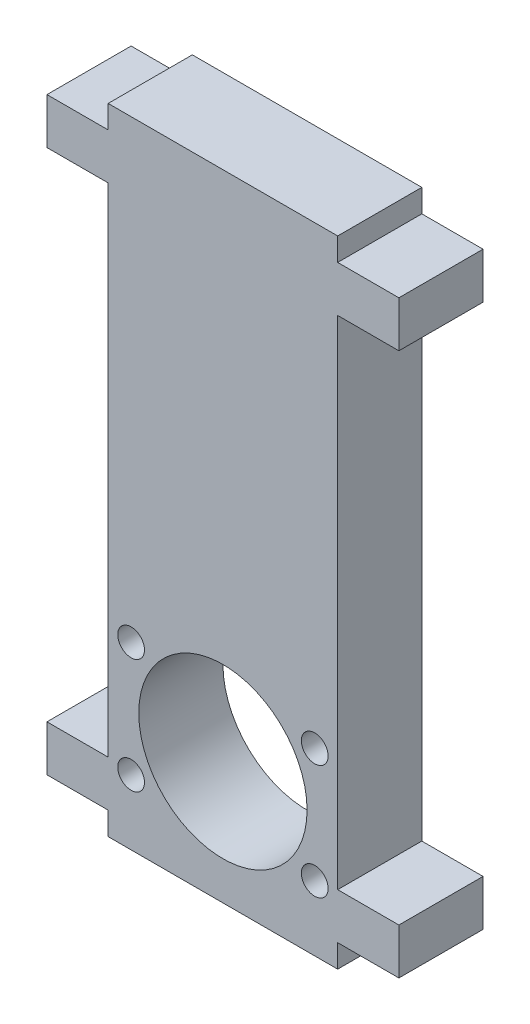
ISO-10303-21;
HEADER;
FILE_DESCRIPTION(('STEP AP214'),'2;1');
FILE_NAME('part.step','',(''),(''),'','','');
FILE_SCHEMA(('AUTOMOTIVE_DESIGN { 1 0 10303 214 1 1 1 1 }'));
ENDSEC;
DATA;
#1=APPLICATION_CONTEXT('core data for automotive mechanical design processes');
#2=APPLICATION_PROTOCOL_DEFINITION('international standard','automotive_design',2000,#1);
#3=PRODUCT_CONTEXT('',#1,'mechanical');
#4=PRODUCT('Part','Part','',(#3));
#5=PRODUCT_RELATED_PRODUCT_CATEGORY('part','',(#4));
#6=PRODUCT_DEFINITION_FORMATION('','',#4);
#7=PRODUCT_DEFINITION_CONTEXT('part definition',#1,'design');
#8=PRODUCT_DEFINITION('design','',#6,#7);
#9=PRODUCT_DEFINITION_SHAPE('','',#8);
#10=(LENGTH_UNIT() NAMED_UNIT(*) SI_UNIT(.MILLI.,.METRE.));
#11=(NAMED_UNIT(*) PLANE_ANGLE_UNIT() SI_UNIT($,.RADIAN.));
#12=(NAMED_UNIT(*) SI_UNIT($,.STERADIAN.) SOLID_ANGLE_UNIT());
#13=UNCERTAINTY_MEASURE_WITH_UNIT(LENGTH_MEASURE(1.E-05),#10,'distance_accuracy_value','');
#14=(GEOMETRIC_REPRESENTATION_CONTEXT(3) GLOBAL_UNCERTAINTY_ASSIGNED_CONTEXT((#13)) GLOBAL_UNIT_ASSIGNED_CONTEXT((#10,
#11,#12)) REPRESENTATION_CONTEXT('',''));
#15=CARTESIAN_POINT('',(0.,0.,0.));
#16=DIRECTION('',(0.,0.,1.));
#17=DIRECTION('',(1.,0.,0.));
#18=AXIS2_PLACEMENT_3D('',#15,#16,#17);
#19=CARTESIAN_POINT('',(-33.0650532581454,-22.7071428571428,11.0000000000002));
#20=DIRECTION('',(0.,0.,1.));
#21=DIRECTION('',(1.,0.,0.));
#22=AXIS2_PLACEMENT_3D('',#19,#20,#21);
#23=PLANE('',#22);
#24=DIRECTION('',(0.,1.,0.));
#25=VECTOR('',#24,1.);
#26=CARTESIAN_POINT('',(-3.06505325814538,-16.7071428571428,11.0000000000002));
#27=LINE('',#26,#25);
#28=CARTESIAN_POINT('',(-3.06505325814538,-16.7071428571428,11.0000000000002));
#29=VERTEX_POINT('',#28);
#30=CARTESIAN_POINT('',(-3.06505325814536,48.2928571428572,11.0000000000002));
#31=VERTEX_POINT('',#30);
#32=EDGE_CURVE('E315',#29,#31,#27,.T.);
#33=ORIENTED_EDGE('',*,*,#32,.T.);
#34=DIRECTION('',(1.,0.,0.));
#35=VECTOR('',#34,1.);
#36=CARTESIAN_POINT('',(-3.06505325814536,48.2928571428572,11.0000000000002));
#37=LINE('',#36,#35);
#38=CARTESIAN_POINT('',(4.93494674185465,48.2928571428572,11.0000000000002));
#39=VERTEX_POINT('',#38);
#40=EDGE_CURVE('E321',#31,#39,#37,.T.);
#41=ORIENTED_EDGE('',*,*,#40,.T.);
#42=DIRECTION('',(0.,1.,0.));
#43=VECTOR('',#42,1.);
#44=CARTESIAN_POINT('',(4.93494674185465,48.2928571428572,11.0000000000002));
#45=LINE('',#44,#43);
#46=CARTESIAN_POINT('',(4.93494674185464,54.2928571428572,11.0000000000002));
#47=VERTEX_POINT('',#46);
#48=EDGE_CURVE('E323',#39,#47,#45,.T.);
#49=ORIENTED_EDGE('',*,*,#48,.T.);
#50=DIRECTION('',(-1.,0.,0.));
#51=VECTOR('',#50,1.);
#52=CARTESIAN_POINT('',(4.93494674185464,54.2928571428572,11.0000000000002));
#53=LINE('',#52,#51);
#54=CARTESIAN_POINT('',(-3.06505325814536,54.2928571428572,11.0000000000002));
#55=VERTEX_POINT('',#54);
#56=EDGE_CURVE('E325',#47,#55,#53,.T.);
#57=ORIENTED_EDGE('',*,*,#56,.T.);
#58=DIRECTION('',(0.,1.,0.));
#59=VECTOR('',#58,1.);
#60=CARTESIAN_POINT('',(-3.06505325814536,54.2928571428572,11.0000000000002));
#61=LINE('',#60,#59);
#62=CARTESIAN_POINT('',(-3.06505325814536,57.2928571428572,11.0000000000002));
#63=VERTEX_POINT('',#62);
#64=EDGE_CURVE('E327',#55,#63,#61,.T.);
#65=ORIENTED_EDGE('',*,*,#64,.T.);
#66=DIRECTION('',(-1.,0.,0.));
#67=VECTOR('',#66,1.);
#68=CARTESIAN_POINT('',(-8.06505325814537,57.2928571428572,11.0000000000002));
#69=LINE('',#68,#67);
#70=CARTESIAN_POINT('',(-33.0650532581454,57.2928571428572,11.0000000000002));
#71=VERTEX_POINT('',#70);
#72=EDGE_CURVE('E329',#63,#71,#69,.T.);
#73=ORIENTED_EDGE('',*,*,#72,.T.);
#74=DIRECTION('',(0.,-1.,0.));
#75=VECTOR('',#74,1.);
#76=CARTESIAN_POINT('',(-33.0650532581454,57.2928571428572,11.0000000000002));
#77=LINE('',#76,#75);
#78=CARTESIAN_POINT('',(-33.0650532581454,54.2928571428572,11.0000000000002));
#79=VERTEX_POINT('',#78);
#80=EDGE_CURVE('E331',#71,#79,#77,.T.);
#81=ORIENTED_EDGE('',*,*,#80,.T.);
#82=DIRECTION('',(-1.,0.,0.));
#83=VECTOR('',#82,1.);
#84=CARTESIAN_POINT('',(-33.0650532581454,54.2928571428572,11.0000000000002));
#85=LINE('',#84,#83);
#86=CARTESIAN_POINT('',(-41.0650532581454,54.2928571428572,11.0000000000002));
#87=VERTEX_POINT('',#86);
#88=EDGE_CURVE('E333',#79,#87,#85,.T.);
#89=ORIENTED_EDGE('',*,*,#88,.T.);
#90=DIRECTION('',(0.,-1.,0.));
#91=VECTOR('',#90,1.);
#92=CARTESIAN_POINT('',(-41.0650532581454,54.2928571428572,11.0000000000002));
#93=LINE('',#92,#91);
#94=CARTESIAN_POINT('',(-41.0650532581454,48.2928571428572,11.0000000000002));
#95=VERTEX_POINT('',#94);
#96=EDGE_CURVE('E335',#87,#95,#93,.T.);
#97=ORIENTED_EDGE('',*,*,#96,.T.);
#98=DIRECTION('',(1.,0.,0.));
#99=VECTOR('',#98,1.);
#100=CARTESIAN_POINT('',(-41.0650532581454,48.2928571428572,11.0000000000002));
#101=LINE('',#100,#99);
#102=CARTESIAN_POINT('',(-33.0650532581454,48.2928571428572,11.0000000000002));
#103=VERTEX_POINT('',#102);
#104=EDGE_CURVE('E337',#95,#103,#101,.T.);
#105=ORIENTED_EDGE('',*,*,#104,.T.);
#106=DIRECTION('',(0.,-1.,0.));
#107=VECTOR('',#106,1.);
#108=CARTESIAN_POINT('',(-33.0650532581454,48.2928571428572,11.0000000000002));
#109=LINE('',#108,#107);
#110=CARTESIAN_POINT('',(-33.0650532581454,-16.7071428571428,11.0000000000002));
#111=VERTEX_POINT('',#110);
#112=EDGE_CURVE('E183',#103,#111,#109,.T.);
#113=ORIENTED_EDGE('',*,*,#112,.T.);
#114=DIRECTION('',(-1.,0.,0.));
#115=VECTOR('',#114,1.);
#116=CARTESIAN_POINT('',(-33.0650532581454,-16.7071428571428,11.0000000000002));
#117=LINE('',#116,#115);
#118=CARTESIAN_POINT('',(-41.0650532581454,-16.7071428571428,11.0000000000002));
#119=VERTEX_POINT('',#118);
#120=EDGE_CURVE('E177',#111,#119,#117,.T.);
#121=ORIENTED_EDGE('',*,*,#120,.T.);
#122=DIRECTION('',(0.,-1.,0.));
#123=VECTOR('',#122,1.);
#124=CARTESIAN_POINT('',(-41.0650532581454,-16.7071428571428,11.0000000000002));
#125=LINE('',#124,#123);
#126=CARTESIAN_POINT('',(-41.0650532581454,-22.7071428571428,11.0000000000002));
#127=VERTEX_POINT('',#126);
#128=EDGE_CURVE('E181',#119,#127,#125,.T.);
#129=ORIENTED_EDGE('',*,*,#128,.T.);
#130=DIRECTION('',(1.,0.,0.));
#131=VECTOR('',#130,1.);
#132=CARTESIAN_POINT('',(-41.0650532581454,-22.7071428571428,11.0000000000002));
#133=LINE('',#132,#131);
#134=CARTESIAN_POINT('',(-33.0650532581454,-22.7071428571428,11.0000000000002));
#135=VERTEX_POINT('',#134);
#136=EDGE_CURVE('E49',#127,#135,#133,.T.);
#137=ORIENTED_EDGE('',*,*,#136,.T.);
#138=DIRECTION('',(0.,-1.,0.));
#139=VECTOR('',#138,1.);
#140=CARTESIAN_POINT('',(-33.0650532581454,-22.7071428571428,11.0000000000002));
#141=LINE('',#140,#139);
#142=CARTESIAN_POINT('',(-33.0650532581454,-25.7071428571428,11.0000000000002));
#143=VERTEX_POINT('',#142);
#144=EDGE_CURVE('E243',#135,#143,#141,.T.);
#145=ORIENTED_EDGE('',*,*,#144,.T.);
#146=DIRECTION('',(1.,0.,0.));
#147=VECTOR('',#146,1.);
#148=CARTESIAN_POINT('',(-33.0650532581454,-25.7071428571428,11.0000000000002));
#149=LINE('',#148,#147);
#150=CARTESIAN_POINT('',(-3.06505325814537,-25.7071428571428,11.0000000000002));
#151=VERTEX_POINT('',#150);
#152=EDGE_CURVE('E128',#143,#151,#149,.T.);
#153=ORIENTED_EDGE('',*,*,#152,.T.);
#154=DIRECTION('',(0.,1.,0.));
#155=VECTOR('',#154,1.);
#156=CARTESIAN_POINT('',(-3.06505325814537,-25.7071428571428,11.0000000000002));
#157=LINE('',#156,#155);
#158=CARTESIAN_POINT('',(-3.06505325814537,-22.7071428571428,11.0000000000002));
#159=VERTEX_POINT('',#158);
#160=EDGE_CURVE('E294',#151,#159,#157,.T.);
#161=ORIENTED_EDGE('',*,*,#160,.T.);
#162=DIRECTION('',(1.,0.,0.));
#163=VECTOR('',#162,1.);
#164=CARTESIAN_POINT('',(-3.06505325814537,-22.7071428571428,11.0000000000002));
#165=LINE('',#164,#163);
#166=CARTESIAN_POINT('',(4.93494674185462,-22.7071428571428,11.0000000000002));
#167=VERTEX_POINT('',#166);
#168=EDGE_CURVE('E313',#159,#167,#165,.T.);
#169=ORIENTED_EDGE('',*,*,#168,.T.);
#170=DIRECTION('',(0.,1.,0.));
#171=VECTOR('',#170,1.);
#172=CARTESIAN_POINT('',(4.93494674185462,-22.7071428571428,11.0000000000002));
#173=LINE('',#172,#171);
#174=CARTESIAN_POINT('',(4.93494674185462,-16.7071428571428,11.0000000000002));
#175=VERTEX_POINT('',#174);
#176=EDGE_CURVE('E310',#167,#175,#173,.T.);
#177=ORIENTED_EDGE('',*,*,#176,.T.);
#178=DIRECTION('',(-1.,0.,0.));
#179=VECTOR('',#178,1.);
#180=CARTESIAN_POINT('',(4.93494674185462,-16.7071428571428,11.0000000000002));
#181=LINE('',#180,#179);
#182=EDGE_CURVE('E312',#175,#29,#181,.T.);
#183=ORIENTED_EDGE('',*,*,#182,.T.);
#184=EDGE_LOOP('',(#33,#41,#49,#57,#65,#73,#81,#89,#97,#105,#113,#121,#129,#137,#145,#153,#161,
#169,#177,#183));
#185=FACE_BOUND('',#184,.T.);
#186=CARTESIAN_POINT('',(-6.06505325814538,-17.2071428571428,11.0000000000002));
#187=DIRECTION('',(0.,0.,1.));
#188=DIRECTION('',(1.,0.,0.));
#189=AXIS2_PLACEMENT_3D('',#186,#187,#188);
#190=CIRCLE('',#189,1.75);
#191=CARTESIAN_POINT('',(-4.31505325814537,-17.2071428571428,11.0000000000002));
#192=VERTEX_POINT('',#191);
#193=EDGE_CURVE('E397',#192,#192,#190,.T.);
#194=ORIENTED_EDGE('',*,*,#193,.F.);
#195=EDGE_LOOP('',(#194));
#196=FACE_BOUND('',#195,.T.);
#197=CARTESIAN_POINT('',(-30.0650532581454,-2.20714285714284,11.0000000000002));
#198=DIRECTION('',(0.,0.,1.));
#199=DIRECTION('',(1.,0.,0.));
#200=AXIS2_PLACEMENT_3D('',#197,#198,#199);
#201=CIRCLE('',#200,1.75);
#202=CARTESIAN_POINT('',(-28.3150532581454,-2.20714285714284,11.0000000000002));
#203=VERTEX_POINT('',#202);
#204=EDGE_CURVE('E409',#203,#203,#201,.T.);
#205=ORIENTED_EDGE('',*,*,#204,.F.);
#206=EDGE_LOOP('',(#205));
#207=FACE_BOUND('',#206,.T.);
#208=CARTESIAN_POINT('',(-18.0650532581454,-9.70714285714284,11.0000000000002));
#209=DIRECTION('',(0.,0.,1.));
#210=DIRECTION('',(1.,0.,0.));
#211=AXIS2_PLACEMENT_3D('',#208,#209,#210);
#212=CIRCLE('',#211,11.);
#213=CARTESIAN_POINT('',(-7.06505325814538,-9.70714285714284,11.0000000000002));
#214=VERTEX_POINT('',#213);
#215=EDGE_CURVE('E205',#214,#214,#212,.T.);
#216=ORIENTED_EDGE('',*,*,#215,.F.);
#217=EDGE_LOOP('',(#216));
#218=FACE_BOUND('',#217,.T.);
#219=CARTESIAN_POINT('',(-6.06505325814538,-2.20714285714284,11.0000000000002));
#220=DIRECTION('',(0.,0.,1.));
#221=DIRECTION('',(1.,0.,0.));
#222=AXIS2_PLACEMENT_3D('',#219,#220,#221);
#223=CIRCLE('',#222,1.74999999999999);
#224=CARTESIAN_POINT('',(-4.31505325814538,-2.20714285714284,11.0000000000002));
#225=VERTEX_POINT('',#224);
#226=EDGE_CURVE('E403',#225,#225,#223,.T.);
#227=ORIENTED_EDGE('',*,*,#226,.F.);
#228=EDGE_LOOP('',(#227));
#229=FACE_BOUND('',#228,.T.);
#230=CARTESIAN_POINT('',(-30.0650532581454,-17.2071428571428,11.0000000000002));
#231=DIRECTION('',(0.,0.,1.));
#232=DIRECTION('',(1.,0.,0.));
#233=AXIS2_PLACEMENT_3D('',#230,#231,#232);
#234=CIRCLE('',#233,1.75);
#235=CARTESIAN_POINT('',(-28.3150532581454,-17.2071428571428,11.0000000000002));
#236=VERTEX_POINT('',#235);
#237=EDGE_CURVE('E388',#236,#236,#234,.T.);
#238=ORIENTED_EDGE('',*,*,#237,.F.);
#239=EDGE_LOOP('',(#238));
#240=FACE_BOUND('',#239,.T.);
#241=ADVANCED_FACE('F32',(#185,#196,#207,#218,#229,#240),#23,.T.);
#242=CARTESIAN_POINT('',(-33.0650532581454,-22.7071428571428,1.58563131088319E-13));
#243=DIRECTION('',(0.,0.,1.));
#244=DIRECTION('',(1.,0.,0.));
#245=AXIS2_PLACEMENT_3D('',#242,#243,#244);
#246=PLANE('',#245);
#247=DIRECTION('',(0.,1.,0.));
#248=VECTOR('',#247,1.);
#249=CARTESIAN_POINT('',(-3.06505325814539,7.29285714285716,1.58563131088319E-13));
#250=LINE('',#249,#248);
#251=CARTESIAN_POINT('',(-3.06505325814538,-16.7071428571428,1.58563131088319E-13));
#252=VERTEX_POINT('',#251);
#253=CARTESIAN_POINT('',(-3.06505325814536,48.2928571428572,1.58563131088319E-13));
#254=VERTEX_POINT('',#253);
#255=EDGE_CURVE('E216',#252,#254,#250,.T.);
#256=ORIENTED_EDGE('',*,*,#255,.F.);
#257=DIRECTION('',(-1.,0.,0.));
#258=VECTOR('',#257,1.);
#259=CARTESIAN_POINT('',(4.93494674185462,-16.7071428571428,1.58563131088319E-13));
#260=LINE('',#259,#258);
#261=CARTESIAN_POINT('',(4.93494674185462,-16.7071428571428,1.58563131088319E-13));
#262=VERTEX_POINT('',#261);
#263=EDGE_CURVE('E213',#262,#252,#260,.T.);
#264=ORIENTED_EDGE('',*,*,#263,.F.);
#265=DIRECTION('',(0.,1.,0.));
#266=VECTOR('',#265,1.);
#267=CARTESIAN_POINT('',(4.93494674185462,-22.7071428571428,1.58563131088319E-13));
#268=LINE('',#267,#266);
#269=CARTESIAN_POINT('',(4.93494674185462,-22.7071428571428,1.58563131088319E-13));
#270=VERTEX_POINT('',#269);
#271=EDGE_CURVE('E211',#270,#262,#268,.T.);
#272=ORIENTED_EDGE('',*,*,#271,.F.);
#273=DIRECTION('',(1.,0.,0.));
#274=VECTOR('',#273,1.);
#275=CARTESIAN_POINT('',(-3.06505325814537,-22.7071428571428,1.58563131088319E-13));
#276=LINE('',#275,#274);
#277=CARTESIAN_POINT('',(-3.06505325814537,-22.7071428571428,1.58563131088319E-13));
#278=VERTEX_POINT('',#277);
#279=EDGE_CURVE('E209',#278,#270,#276,.T.);
#280=ORIENTED_EDGE('',*,*,#279,.F.);
#281=DIRECTION('',(0.,1.,0.));
#282=VECTOR('',#281,1.);
#283=CARTESIAN_POINT('',(-3.06505325814537,-25.7071428571428,1.58563131088319E-13));
#284=LINE('',#283,#282);
#285=CARTESIAN_POINT('',(-3.06505325814537,-25.7071428571428,1.58563131088319E-13));
#286=VERTEX_POINT('',#285);
#287=EDGE_CURVE('E207',#286,#278,#284,.T.);
#288=ORIENTED_EDGE('',*,*,#287,.F.);
#289=DIRECTION('',(1.,0.,0.));
#290=VECTOR('',#289,1.);
#291=CARTESIAN_POINT('',(-33.0650532581454,-25.7071428571428,1.58563131088319E-13));
#292=LINE('',#291,#290);
#293=CARTESIAN_POINT('',(-33.0650532581454,-25.7071428571428,1.58563131088319E-13));
#294=VERTEX_POINT('',#293);
#295=EDGE_CURVE('E204',#294,#286,#292,.T.);
#296=ORIENTED_EDGE('',*,*,#295,.F.);
#297=DIRECTION('',(0.,-1.,0.));
#298=VECTOR('',#297,1.);
#299=CARTESIAN_POINT('',(-33.0650532581454,-22.7071428571428,1.58563131088319E-13));
#300=LINE('',#299,#298);
#301=CARTESIAN_POINT('',(-33.0650532581454,-22.7071428571428,1.58563131088319E-13));
#302=VERTEX_POINT('',#301);
#303=EDGE_CURVE('E201',#302,#294,#300,.T.);
#304=ORIENTED_EDGE('',*,*,#303,.F.);
#305=DIRECTION('',(1.,0.,0.));
#306=VECTOR('',#305,1.);
#307=CARTESIAN_POINT('',(-41.0650532581454,-22.7071428571428,1.58563131088319E-13));
#308=LINE('',#307,#306);
#309=CARTESIAN_POINT('',(-41.0650532581454,-22.7071428571428,1.58563131088319E-13));
#310=VERTEX_POINT('',#309);
#311=EDGE_CURVE('E120',#310,#302,#308,.T.);
#312=ORIENTED_EDGE('',*,*,#311,.F.);
#313=DIRECTION('',(0.,-1.,0.));
#314=VECTOR('',#313,1.);
#315=CARTESIAN_POINT('',(-41.0650532581454,-16.7071428571428,1.58563131088319E-13));
#316=LINE('',#315,#314);
#317=CARTESIAN_POINT('',(-41.0650532581454,-16.7071428571428,1.58563131088319E-13));
#318=VERTEX_POINT('',#317);
#319=EDGE_CURVE('E114',#318,#310,#316,.T.);
#320=ORIENTED_EDGE('',*,*,#319,.F.);
#321=DIRECTION('',(-1.,0.,0.));
#322=VECTOR('',#321,1.);
#323=CARTESIAN_POINT('',(-33.0650532581454,-16.7071428571428,1.58563131088319E-13));
#324=LINE('',#323,#322);
#325=CARTESIAN_POINT('',(-33.0650532581454,-16.7071428571428,1.58563131088319E-13));
#326=VERTEX_POINT('',#325);
#327=EDGE_CURVE('E191',#326,#318,#324,.T.);
#328=ORIENTED_EDGE('',*,*,#327,.F.);
#329=DIRECTION('',(0.,-1.,0.));
#330=VECTOR('',#329,1.);
#331=CARTESIAN_POINT('',(-33.0650532581454,-12.6071428571428,1.58563131088319E-13));
#332=LINE('',#331,#330);
#333=CARTESIAN_POINT('',(-33.0650532581454,48.2928571428572,1.58563131088319E-13));
#334=VERTEX_POINT('',#333);
#335=EDGE_CURVE('E238',#334,#326,#332,.T.);
#336=ORIENTED_EDGE('',*,*,#335,.F.);
#337=DIRECTION('',(1.,0.,0.));
#338=VECTOR('',#337,1.);
#339=CARTESIAN_POINT('',(-41.0650532581454,48.2928571428572,1.58563131088319E-13));
#340=LINE('',#339,#338);
#341=CARTESIAN_POINT('',(-41.0650532581454,48.2928571428572,1.58563131088319E-13));
#342=VERTEX_POINT('',#341);
#343=EDGE_CURVE('E235',#342,#334,#340,.T.);
#344=ORIENTED_EDGE('',*,*,#343,.F.);
#345=DIRECTION('',(0.,-1.,0.));
#346=VECTOR('',#345,1.);
#347=CARTESIAN_POINT('',(-41.0650532581454,54.2928571428572,1.58563131088319E-13));
#348=LINE('',#347,#346);
#349=CARTESIAN_POINT('',(-41.0650532581454,54.2928571428572,1.58563131088319E-13));
#350=VERTEX_POINT('',#349);
#351=EDGE_CURVE('E233',#350,#342,#348,.T.);
#352=ORIENTED_EDGE('',*,*,#351,.F.);
#353=DIRECTION('',(-1.,0.,0.));
#354=VECTOR('',#353,1.);
#355=CARTESIAN_POINT('',(-33.0650532581454,54.2928571428572,1.58563131088319E-13));
#356=LINE('',#355,#354);
#357=CARTESIAN_POINT('',(-33.0650532581454,54.2928571428572,1.58563131088319E-13));
#358=VERTEX_POINT('',#357);
#359=EDGE_CURVE('E231',#358,#350,#356,.T.);
#360=ORIENTED_EDGE('',*,*,#359,.F.);
#361=DIRECTION('',(0.,-1.,0.));
#362=VECTOR('',#361,1.);
#363=CARTESIAN_POINT('',(-33.0650532581454,57.2928571428572,1.58563131088319E-13));
#364=LINE('',#363,#362);
#365=CARTESIAN_POINT('',(-33.0650532581454,57.2928571428572,1.58563131088319E-13));
#366=VERTEX_POINT('',#365);
#367=EDGE_CURVE('E229',#366,#358,#364,.T.);
#368=ORIENTED_EDGE('',*,*,#367,.F.);
#369=DIRECTION('',(-1.,0.,0.));
#370=VECTOR('',#369,1.);
#371=CARTESIAN_POINT('',(-33.0650532581454,57.2928571428572,1.58563131088319E-13));
#372=LINE('',#371,#370);
#373=CARTESIAN_POINT('',(-3.06505325814536,57.2928571428572,1.58563131088319E-13));
#374=VERTEX_POINT('',#373);
#375=EDGE_CURVE('E227',#374,#366,#372,.T.);
#376=ORIENTED_EDGE('',*,*,#375,.F.);
#377=DIRECTION('',(0.,1.,0.));
#378=VECTOR('',#377,1.);
#379=CARTESIAN_POINT('',(-3.06505325814536,54.2928571428572,1.58563131088319E-13));
#380=LINE('',#379,#378);
#381=CARTESIAN_POINT('',(-3.06505325814536,54.2928571428572,1.58563131088319E-13));
#382=VERTEX_POINT('',#381);
#383=EDGE_CURVE('E224',#382,#374,#380,.T.);
#384=ORIENTED_EDGE('',*,*,#383,.F.);
#385=DIRECTION('',(-1.,0.,0.));
#386=VECTOR('',#385,1.);
#387=CARTESIAN_POINT('',(4.93494674185464,54.2928571428572,1.58563131088319E-13));
#388=LINE('',#387,#386);
#389=CARTESIAN_POINT('',(4.93494674185464,54.2928571428572,1.58563131088319E-13));
#390=VERTEX_POINT('',#389);
#391=EDGE_CURVE('E222',#390,#382,#388,.T.);
#392=ORIENTED_EDGE('',*,*,#391,.F.);
#393=DIRECTION('',(0.,1.,0.));
#394=VECTOR('',#393,1.);
#395=CARTESIAN_POINT('',(4.93494674185465,48.2928571428572,1.58563131088319E-13));
#396=LINE('',#395,#394);
#397=CARTESIAN_POINT('',(4.93494674185465,48.2928571428572,1.58563131088319E-13));
#398=VERTEX_POINT('',#397);
#399=EDGE_CURVE('E220',#398,#390,#396,.T.);
#400=ORIENTED_EDGE('',*,*,#399,.F.);
#401=DIRECTION('',(1.,0.,0.));
#402=VECTOR('',#401,1.);
#403=CARTESIAN_POINT('',(-3.06505325814536,48.2928571428572,1.58563131088319E-13));
#404=LINE('',#403,#402);
#405=EDGE_CURVE('E218',#254,#398,#404,.T.);
#406=ORIENTED_EDGE('',*,*,#405,.F.);
#407=EDGE_LOOP('',(#256,#264,#272,#280,#288,#296,#304,#312,#320,#328,#336,#344,#352,#360,#368,
#376,#384,#392,#400,#406));
#408=FACE_BOUND('',#407,.T.);
#409=CARTESIAN_POINT('',(-18.0650532581454,-9.70714285714284,1.58563131088319E-13));
#410=DIRECTION('',(0.,0.,1.));
#411=DIRECTION('',(1.,0.,0.));
#412=AXIS2_PLACEMENT_3D('',#409,#410,#411);
#413=CIRCLE('',#412,11.);
#414=CARTESIAN_POINT('',(-7.06505325814538,-9.70714285714284,1.58563131088319E-13));
#415=VERTEX_POINT('',#414);
#416=EDGE_CURVE('E412',#415,#415,#413,.T.);
#417=ORIENTED_EDGE('',*,*,#416,.T.);
#418=EDGE_LOOP('',(#417));
#419=FACE_BOUND('',#418,.T.);
#420=CARTESIAN_POINT('',(-30.0650532581454,-2.20714285714284,1.58563131088319E-13));
#421=DIRECTION('',(0.,0.,1.));
#422=DIRECTION('',(1.,0.,0.));
#423=AXIS2_PLACEMENT_3D('',#420,#421,#422);
#424=CIRCLE('',#423,1.75);
#425=CARTESIAN_POINT('',(-28.3150532581454,-2.20714285714284,1.58563131088319E-13));
#426=VERTEX_POINT('',#425);
#427=EDGE_CURVE('E406',#426,#426,#424,.T.);
#428=ORIENTED_EDGE('',*,*,#427,.T.);
#429=EDGE_LOOP('',(#428));
#430=FACE_BOUND('',#429,.T.);
#431=CARTESIAN_POINT('',(-6.06505325814538,-2.20714285714284,1.58563131088319E-13));
#432=DIRECTION('',(0.,0.,1.));
#433=DIRECTION('',(1.,0.,0.));
#434=AXIS2_PLACEMENT_3D('',#431,#432,#433);
#435=CIRCLE('',#434,1.74999999999999);
#436=CARTESIAN_POINT('',(-4.31505325814538,-2.20714285714284,1.58563131088319E-13));
#437=VERTEX_POINT('',#436);
#438=EDGE_CURVE('E400',#437,#437,#435,.T.);
#439=ORIENTED_EDGE('',*,*,#438,.T.);
#440=EDGE_LOOP('',(#439));
#441=FACE_BOUND('',#440,.T.);
#442=CARTESIAN_POINT('',(-6.06505325814538,-17.2071428571428,1.58563131088319E-13));
#443=DIRECTION('',(0.,0.,1.));
#444=DIRECTION('',(1.,0.,0.));
#445=AXIS2_PLACEMENT_3D('',#442,#443,#444);
#446=CIRCLE('',#445,1.75);
#447=CARTESIAN_POINT('',(-4.31505325814537,-17.2071428571428,1.58563131088319E-13));
#448=VERTEX_POINT('',#447);
#449=EDGE_CURVE('E394',#448,#448,#446,.T.);
#450=ORIENTED_EDGE('',*,*,#449,.T.);
#451=EDGE_LOOP('',(#450));
#452=FACE_BOUND('',#451,.T.);
#453=CARTESIAN_POINT('',(-30.0650532581454,-17.2071428571428,1.58563131088319E-13));
#454=DIRECTION('',(0.,0.,1.));
#455=DIRECTION('',(1.,0.,0.));
#456=AXIS2_PLACEMENT_3D('',#453,#454,#455);
#457=CIRCLE('',#456,1.75);
#458=CARTESIAN_POINT('',(-28.3150532581454,-17.2071428571428,1.58563131088319E-13));
#459=VERTEX_POINT('',#458);
#460=EDGE_CURVE('E391',#459,#459,#457,.T.);
#461=ORIENTED_EDGE('',*,*,#460,.T.);
#462=EDGE_LOOP('',(#461));
#463=FACE_BOUND('',#462,.T.);
#464=ADVANCED_FACE('F297',(#408,#419,#430,#441,#452,#463),#246,.F.);
#465=CARTESIAN_POINT('',(-33.0650532581454,-22.7071428571428,11.0000000000002));
#466=DIRECTION('',(1.,0.,0.));
#467=DIRECTION('',(0.,1.,0.));
#468=AXIS2_PLACEMENT_3D('',#465,#466,#467);
#469=PLANE('',#468);
#470=ORIENTED_EDGE('',*,*,#303,.T.);
#471=DIRECTION('',(0.,0.,-1.));
#472=VECTOR('',#471,1.);
#473=CARTESIAN_POINT('',(-33.0650532581454,-25.7071428571428,11.0000000000002));
#474=LINE('',#473,#472);
#475=EDGE_CURVE('E11',#143,#294,#474,.T.);
#476=ORIENTED_EDGE('',*,*,#475,.F.);
#477=ORIENTED_EDGE('',*,*,#144,.F.);
#478=DIRECTION('',(0.,0.,-1.));
#479=VECTOR('',#478,1.);
#480=CARTESIAN_POINT('',(-33.0650532581454,-22.7071428571428,11.0000000000002));
#481=LINE('',#480,#479);
#482=EDGE_CURVE('E197',#135,#302,#481,.T.);
#483=ORIENTED_EDGE('',*,*,#482,.T.);
#484=EDGE_LOOP('',(#470,#476,#477,#483));
#485=FACE_BOUND('',#484,.T.);
#486=ADVANCED_FACE('F34',(#485),#469,.F.);
#487=CARTESIAN_POINT('',(-33.0650532581454,-25.7071428571428,11.0000000000002));
#488=DIRECTION('',(0.,1.,0.));
#489=DIRECTION('',(-1.,0.,0.));
#490=AXIS2_PLACEMENT_3D('',#487,#488,#489);
#491=PLANE('',#490);
#492=ORIENTED_EDGE('',*,*,#295,.T.);
#493=DIRECTION('',(0.,0.,-1.));
#494=VECTOR('',#493,1.);
#495=CARTESIAN_POINT('',(-3.06505325814537,-25.7071428571428,11.0000000000002));
#496=LINE('',#495,#494);
#497=EDGE_CURVE('E41',#151,#286,#496,.T.);
#498=ORIENTED_EDGE('',*,*,#497,.F.);
#499=ORIENTED_EDGE('',*,*,#152,.F.);
#500=ORIENTED_EDGE('',*,*,#475,.T.);
#501=EDGE_LOOP('',(#492,#498,#499,#500));
#502=FACE_BOUND('',#501,.T.);
#503=ADVANCED_FACE('F603',(#502),#491,.F.);
#504=CARTESIAN_POINT('',(-3.06505325814537,-25.7071428571428,11.0000000000002));
#505=DIRECTION('',(-1.,0.,0.));
#506=DIRECTION('',(0.,-1.,0.));
#507=AXIS2_PLACEMENT_3D('',#504,#505,#506);
#508=PLANE('',#507);
#509=ORIENTED_EDGE('',*,*,#287,.T.);
#510=DIRECTION('',(0.,0.,-1.));
#511=VECTOR('',#510,1.);
#512=CARTESIAN_POINT('',(-3.06505325814537,-22.7071428571428,11.0000000000002));
#513=LINE('',#512,#511);
#514=EDGE_CURVE('E286',#159,#278,#513,.T.);
#515=ORIENTED_EDGE('',*,*,#514,.F.);
#516=ORIENTED_EDGE('',*,*,#160,.F.);
#517=ORIENTED_EDGE('',*,*,#497,.T.);
#518=EDGE_LOOP('',(#509,#515,#516,#517));
#519=FACE_BOUND('',#518,.T.);
#520=ADVANCED_FACE('F292',(#519),#508,.F.);
#521=CARTESIAN_POINT('',(-3.06505325814537,-22.7071428571428,11.0000000000002));
#522=DIRECTION('',(0.,1.,0.));
#523=DIRECTION('',(-1.,0.,0.));
#524=AXIS2_PLACEMENT_3D('',#521,#522,#523);
#525=PLANE('',#524);
#526=ORIENTED_EDGE('',*,*,#279,.T.);
#527=DIRECTION('',(0.,0.,-1.));
#528=VECTOR('',#527,1.);
#529=CARTESIAN_POINT('',(4.93494674185462,-22.7071428571428,11.0000000000002));
#530=LINE('',#529,#528);
#531=EDGE_CURVE('E283',#167,#270,#530,.T.);
#532=ORIENTED_EDGE('',*,*,#531,.F.);
#533=ORIENTED_EDGE('',*,*,#168,.F.);
#534=ORIENTED_EDGE('',*,*,#514,.T.);
#535=EDGE_LOOP('',(#526,#532,#533,#534));
#536=FACE_BOUND('',#535,.T.);
#537=ADVANCED_FACE('F304',(#536),#525,.F.);
#538=CARTESIAN_POINT('',(4.93494674185462,-22.7071428571428,11.0000000000002));
#539=DIRECTION('',(-1.,0.,0.));
#540=DIRECTION('',(0.,0.,1.));
#541=AXIS2_PLACEMENT_3D('',#538,#539,#540);
#542=PLANE('',#541);
#543=ORIENTED_EDGE('',*,*,#271,.T.);
#544=DIRECTION('',(0.,0.,-1.));
#545=VECTOR('',#544,1.);
#546=CARTESIAN_POINT('',(4.93494674185462,-16.7071428571428,11.0000000000002));
#547=LINE('',#546,#545);
#548=EDGE_CURVE('E280',#175,#262,#547,.T.);
#549=ORIENTED_EDGE('',*,*,#548,.F.);
#550=ORIENTED_EDGE('',*,*,#176,.F.);
#551=ORIENTED_EDGE('',*,*,#531,.T.);
#552=EDGE_LOOP('',(#543,#549,#550,#551));
#553=FACE_BOUND('',#552,.T.);
#554=ADVANCED_FACE('F308',(#553),#542,.F.);
#555=CARTESIAN_POINT('',(4.93494674185462,-16.7071428571428,11.0000000000002));
#556=DIRECTION('',(0.,-1.,0.));
#557=DIRECTION('',(1.,0.,0.));
#558=AXIS2_PLACEMENT_3D('',#555,#556,#557);
#559=PLANE('',#558);
#560=ORIENTED_EDGE('',*,*,#263,.T.);
#561=DIRECTION('',(0.,0.,-1.));
#562=VECTOR('',#561,1.);
#563=CARTESIAN_POINT('',(-3.06505325814538,-16.7071428571428,11.0000000000002));
#564=LINE('',#563,#562);
#565=EDGE_CURVE('E277',#29,#252,#564,.T.);
#566=ORIENTED_EDGE('',*,*,#565,.F.);
#567=ORIENTED_EDGE('',*,*,#182,.F.);
#568=ORIENTED_EDGE('',*,*,#548,.T.);
#569=EDGE_LOOP('',(#560,#566,#567,#568));
#570=FACE_BOUND('',#569,.T.);
#571=ADVANCED_FACE('F573',(#570),#559,.F.);
#572=CARTESIAN_POINT('',(-3.06505325814539,7.29285714285716,11.0000000000002));
#573=DIRECTION('',(-1.,0.,0.));
#574=DIRECTION('',(0.,-1.,0.));
#575=AXIS2_PLACEMENT_3D('',#572,#573,#574);
#576=PLANE('',#575);
#577=DIRECTION('',(0.,0.,-1.));
#578=VECTOR('',#577,1.);
#579=CARTESIAN_POINT('',(-3.06505325814536,48.2928571428572,11.0000000000002));
#580=LINE('',#579,#578);
#581=EDGE_CURVE('E274',#31,#254,#580,.T.);
#582=ORIENTED_EDGE('',*,*,#581,.F.);
#583=ORIENTED_EDGE('',*,*,#32,.F.);
#584=ORIENTED_EDGE('',*,*,#565,.T.);
#585=ORIENTED_EDGE('',*,*,#255,.T.);
#586=EDGE_LOOP('',(#582,#583,#584,#585));
#587=FACE_BOUND('',#586,.T.);
#588=ADVANCED_FACE('F565',(#587),#576,.F.);
#589=CARTESIAN_POINT('',(-3.06505325814536,48.2928571428572,11.0000000000002));
#590=DIRECTION('',(0.,1.,0.));
#591=DIRECTION('',(0.,0.,1.));
#592=AXIS2_PLACEMENT_3D('',#589,#590,#591);
#593=PLANE('',#592);
#594=ORIENTED_EDGE('',*,*,#405,.T.);
#595=DIRECTION('',(0.,0.,-1.));
#596=VECTOR('',#595,1.);
#597=CARTESIAN_POINT('',(4.93494674185465,48.2928571428572,11.0000000000002));
#598=LINE('',#597,#596);
#599=EDGE_CURVE('E271',#39,#398,#598,.T.);
#600=ORIENTED_EDGE('',*,*,#599,.F.);
#601=ORIENTED_EDGE('',*,*,#40,.F.);
#602=ORIENTED_EDGE('',*,*,#581,.T.);
#603=EDGE_LOOP('',(#594,#600,#601,#602));
#604=FACE_BOUND('',#603,.T.);
#605=ADVANCED_FACE('F555',(#604),#593,.F.);
#606=CARTESIAN_POINT('',(4.93494674185465,48.2928571428572,11.0000000000002));
#607=DIRECTION('',(-1.,0.,0.));
#608=DIRECTION('',(0.,-1.,0.));
#609=AXIS2_PLACEMENT_3D('',#606,#607,#608);
#610=PLANE('',#609);
#611=ORIENTED_EDGE('',*,*,#399,.T.);
#612=DIRECTION('',(0.,0.,-1.));
#613=VECTOR('',#612,1.);
#614=CARTESIAN_POINT('',(4.93494674185464,54.2928571428572,11.0000000000002));
#615=LINE('',#614,#613);
#616=EDGE_CURVE('E268',#47,#390,#615,.T.);
#617=ORIENTED_EDGE('',*,*,#616,.F.);
#618=ORIENTED_EDGE('',*,*,#48,.F.);
#619=ORIENTED_EDGE('',*,*,#599,.T.);
#620=EDGE_LOOP('',(#611,#617,#618,#619));
#621=FACE_BOUND('',#620,.T.);
#622=ADVANCED_FACE('F545',(#621),#610,.F.);
#623=CARTESIAN_POINT('',(4.93494674185464,54.2928571428572,11.0000000000002));
#624=DIRECTION('',(0.,-1.,0.));
#625=DIRECTION('',(0.,0.,-1.));
#626=AXIS2_PLACEMENT_3D('',#623,#624,#625);
#627=PLANE('',#626);
#628=ORIENTED_EDGE('',*,*,#391,.T.);
#629=DIRECTION('',(0.,0.,-1.));
#630=VECTOR('',#629,1.);
#631=CARTESIAN_POINT('',(-3.06505325814536,54.2928571428572,11.0000000000002));
#632=LINE('',#631,#630);
#633=EDGE_CURVE('E265',#55,#382,#632,.T.);
#634=ORIENTED_EDGE('',*,*,#633,.F.);
#635=ORIENTED_EDGE('',*,*,#56,.F.);
#636=ORIENTED_EDGE('',*,*,#616,.T.);
#637=EDGE_LOOP('',(#628,#634,#635,#636));
#638=FACE_BOUND('',#637,.T.);
#639=ADVANCED_FACE('F534',(#638),#627,.F.);
#640=CARTESIAN_POINT('',(-3.06505325814536,54.2928571428572,11.0000000000002));
#641=DIRECTION('',(-1.,0.,0.));
#642=DIRECTION('',(0.,-1.,0.));
#643=AXIS2_PLACEMENT_3D('',#640,#641,#642);
#644=PLANE('',#643);
#645=ORIENTED_EDGE('',*,*,#383,.T.);
#646=DIRECTION('',(0.,0.,-1.));
#647=VECTOR('',#646,1.);
#648=CARTESIAN_POINT('',(-3.06505325814536,57.2928571428572,11.0000000000002));
#649=LINE('',#648,#647);
#650=EDGE_CURVE('E262',#63,#374,#649,.T.);
#651=ORIENTED_EDGE('',*,*,#650,.F.);
#652=ORIENTED_EDGE('',*,*,#64,.F.);
#653=ORIENTED_EDGE('',*,*,#633,.T.);
#654=EDGE_LOOP('',(#645,#651,#652,#653));
#655=FACE_BOUND('',#654,.T.);
#656=ADVANCED_FACE('F523',(#655),#644,.F.);
#657=CARTESIAN_POINT('',(-33.0650532581454,57.2928571428572,11.0000000000002));
#658=DIRECTION('',(0.,-1.,0.));
#659=DIRECTION('',(0.,0.,-1.));
#660=AXIS2_PLACEMENT_3D('',#657,#658,#659);
#661=PLANE('',#660);
#662=ORIENTED_EDGE('',*,*,#375,.T.);
#663=DIRECTION('',(0.,0.,-1.));
#664=VECTOR('',#663,1.);
#665=CARTESIAN_POINT('',(-33.0650532581454,57.2928571428572,11.0000000000002));
#666=LINE('',#665,#664);
#667=EDGE_CURVE('E259',#71,#366,#666,.T.);
#668=ORIENTED_EDGE('',*,*,#667,.F.);
#669=ORIENTED_EDGE('',*,*,#72,.F.);
#670=ORIENTED_EDGE('',*,*,#650,.T.);
#671=EDGE_LOOP('',(#662,#668,#669,#670));
#672=FACE_BOUND('',#671,.T.);
#673=ADVANCED_FACE('F513',(#672),#661,.F.);
#674=CARTESIAN_POINT('',(-33.0650532581454,57.2928571428572,11.0000000000002));
#675=DIRECTION('',(1.,0.,0.));
#676=DIRECTION('',(0.,1.,0.));
#677=AXIS2_PLACEMENT_3D('',#674,#675,#676);
#678=PLANE('',#677);
#679=ORIENTED_EDGE('',*,*,#367,.T.);
#680=DIRECTION('',(0.,0.,-1.));
#681=VECTOR('',#680,1.);
#682=CARTESIAN_POINT('',(-33.0650532581454,54.2928571428572,11.0000000000002));
#683=LINE('',#682,#681);
#684=EDGE_CURVE('E256',#79,#358,#683,.T.);
#685=ORIENTED_EDGE('',*,*,#684,.F.);
#686=ORIENTED_EDGE('',*,*,#80,.F.);
#687=ORIENTED_EDGE('',*,*,#667,.T.);
#688=EDGE_LOOP('',(#679,#685,#686,#687));
#689=FACE_BOUND('',#688,.T.);
#690=ADVANCED_FACE('F503',(#689),#678,.F.);
#691=CARTESIAN_POINT('',(-33.0650532581454,54.2928571428572,11.0000000000002));
#692=DIRECTION('',(0.,-1.,0.));
#693=DIRECTION('',(0.,0.,-1.));
#694=AXIS2_PLACEMENT_3D('',#691,#692,#693);
#695=PLANE('',#694);
#696=ORIENTED_EDGE('',*,*,#359,.T.);
#697=DIRECTION('',(0.,0.,-1.));
#698=VECTOR('',#697,1.);
#699=CARTESIAN_POINT('',(-41.0650532581454,54.2928571428572,11.0000000000002));
#700=LINE('',#699,#698);
#701=EDGE_CURVE('E253',#87,#350,#700,.T.);
#702=ORIENTED_EDGE('',*,*,#701,.F.);
#703=ORIENTED_EDGE('',*,*,#88,.F.);
#704=ORIENTED_EDGE('',*,*,#684,.T.);
#705=EDGE_LOOP('',(#696,#702,#703,#704));
#706=FACE_BOUND('',#705,.T.);
#707=ADVANCED_FACE('F493',(#706),#695,.F.);
#708=CARTESIAN_POINT('',(-41.0650532581454,54.2928571428572,11.0000000000002));
#709=DIRECTION('',(1.,0.,0.));
#710=DIRECTION('',(0.,1.,0.));
#711=AXIS2_PLACEMENT_3D('',#708,#709,#710);
#712=PLANE('',#711);
#713=ORIENTED_EDGE('',*,*,#351,.T.);
#714=DIRECTION('',(0.,0.,-1.));
#715=VECTOR('',#714,1.);
#716=CARTESIAN_POINT('',(-41.0650532581454,48.2928571428572,11.0000000000002));
#717=LINE('',#716,#715);
#718=EDGE_CURVE('E250',#95,#342,#717,.T.);
#719=ORIENTED_EDGE('',*,*,#718,.F.);
#720=ORIENTED_EDGE('',*,*,#96,.F.);
#721=ORIENTED_EDGE('',*,*,#701,.T.);
#722=EDGE_LOOP('',(#713,#719,#720,#721));
#723=FACE_BOUND('',#722,.T.);
#724=ADVANCED_FACE('F484',(#723),#712,.F.);
#725=CARTESIAN_POINT('',(-41.0650532581454,48.2928571428572,11.0000000000002));
#726=DIRECTION('',(0.,1.,0.));
#727=DIRECTION('',(0.,0.,1.));
#728=AXIS2_PLACEMENT_3D('',#725,#726,#727);
#729=PLANE('',#728);
#730=ORIENTED_EDGE('',*,*,#343,.T.);
#731=DIRECTION('',(0.,0.,-1.));
#732=VECTOR('',#731,1.);
#733=CARTESIAN_POINT('',(-33.0650532581454,48.2928571428572,11.0000000000002));
#734=LINE('',#733,#732);
#735=EDGE_CURVE('E247',#103,#334,#734,.T.);
#736=ORIENTED_EDGE('',*,*,#735,.F.);
#737=ORIENTED_EDGE('',*,*,#104,.F.);
#738=ORIENTED_EDGE('',*,*,#718,.T.);
#739=EDGE_LOOP('',(#730,#736,#737,#738));
#740=FACE_BOUND('',#739,.T.);
#741=ADVANCED_FACE('F343',(#740),#729,.F.);
#742=CARTESIAN_POINT('',(-33.0650532581454,-12.6071428571428,11.0000000000002));
#743=DIRECTION('',(1.,0.,0.));
#744=DIRECTION('',(0.,1.,0.));
#745=AXIS2_PLACEMENT_3D('',#742,#743,#744);
#746=PLANE('',#745);
#747=ORIENTED_EDGE('',*,*,#335,.T.);
#748=DIRECTION('',(0.,0.,-1.));
#749=VECTOR('',#748,1.);
#750=CARTESIAN_POINT('',(-33.0650532581454,-16.7071428571428,11.0000000000002));
#751=LINE('',#750,#749);
#752=EDGE_CURVE('E192',#111,#326,#751,.T.);
#753=ORIENTED_EDGE('',*,*,#752,.F.);
#754=ORIENTED_EDGE('',*,*,#112,.F.);
#755=ORIENTED_EDGE('',*,*,#735,.T.);
#756=EDGE_LOOP('',(#747,#753,#754,#755));
#757=FACE_BOUND('',#756,.T.);
#758=ADVANCED_FACE('F346',(#757),#746,.F.);
#759=CARTESIAN_POINT('',(-33.0650532581454,-16.7071428571428,11.0000000000002));
#760=DIRECTION('',(0.,-1.,0.));
#761=DIRECTION('',(1.,0.,0.));
#762=AXIS2_PLACEMENT_3D('',#759,#760,#761);
#763=PLANE('',#762);
#764=ORIENTED_EDGE('',*,*,#327,.T.);
#765=DIRECTION('',(0.,0.,-1.));
#766=VECTOR('',#765,1.);
#767=CARTESIAN_POINT('',(-41.0650532581454,-16.7071428571428,11.0000000000002));
#768=LINE('',#767,#766);
#769=EDGE_CURVE('E188',#119,#318,#768,.T.);
#770=ORIENTED_EDGE('',*,*,#769,.F.);
#771=ORIENTED_EDGE('',*,*,#120,.F.);
#772=ORIENTED_EDGE('',*,*,#752,.T.);
#773=EDGE_LOOP('',(#764,#770,#771,#772));
#774=FACE_BOUND('',#773,.T.);
#775=ADVANCED_FACE('F189',(#774),#763,.F.);
#776=CARTESIAN_POINT('',(-41.0650532581454,-16.7071428571428,11.0000000000002));
#777=DIRECTION('',(1.,0.,0.));
#778=DIRECTION('',(0.,0.,-1.));
#779=AXIS2_PLACEMENT_3D('',#776,#777,#778);
#780=PLANE('',#779);
#781=ORIENTED_EDGE('',*,*,#319,.T.);
#782=DIRECTION('',(0.,0.,-1.));
#783=VECTOR('',#782,1.);
#784=CARTESIAN_POINT('',(-41.0650532581454,-22.7071428571428,11.0000000000002));
#785=LINE('',#784,#783);
#786=EDGE_CURVE('E193',#127,#310,#785,.T.);
#787=ORIENTED_EDGE('',*,*,#786,.F.);
#788=ORIENTED_EDGE('',*,*,#128,.F.);
#789=ORIENTED_EDGE('',*,*,#769,.T.);
#790=EDGE_LOOP('',(#781,#787,#788,#789));
#791=FACE_BOUND('',#790,.T.);
#792=ADVANCED_FACE('F195',(#791),#780,.F.);
#793=CARTESIAN_POINT('',(-41.0650532581454,-22.7071428571428,11.0000000000002));
#794=DIRECTION('',(0.,1.,0.));
#795=DIRECTION('',(0.,0.,1.));
#796=AXIS2_PLACEMENT_3D('',#793,#794,#795);
#797=PLANE('',#796);
#798=ORIENTED_EDGE('',*,*,#311,.T.);
#799=ORIENTED_EDGE('',*,*,#482,.F.);
#800=ORIENTED_EDGE('',*,*,#136,.F.);
#801=ORIENTED_EDGE('',*,*,#786,.T.);
#802=EDGE_LOOP('',(#798,#799,#800,#801));
#803=FACE_BOUND('',#802,.T.);
#804=ADVANCED_FACE('F350',(#803),#797,.F.);
#805=CARTESIAN_POINT('',(-18.0650532581454,-9.70714285714284,11.0000000000002));
#806=DIRECTION('',(0.,0.,-1.));
#807=DIRECTION('',(-1.,0.,0.));
#808=AXIS2_PLACEMENT_3D('',#805,#806,#807);
#809=CYLINDRICAL_SURFACE('',#808,11.);
#810=ORIENTED_EDGE('',*,*,#215,.T.);
#811=EDGE_LOOP('',(#810));
#812=FACE_BOUND('',#811,.T.);
#813=ORIENTED_EDGE('',*,*,#416,.F.);
#814=EDGE_LOOP('',(#813));
#815=FACE_BOUND('',#814,.T.);
#816=ADVANCED_FACE('F352',(#812,#815),#809,.F.);
#817=CARTESIAN_POINT('',(-30.0650532581454,-2.20714285714284,11.0000000000002));
#818=DIRECTION('',(0.,0.,-1.));
#819=DIRECTION('',(-1.,0.,0.));
#820=AXIS2_PLACEMENT_3D('',#817,#818,#819);
#821=CYLINDRICAL_SURFACE('',#820,1.75);
#822=ORIENTED_EDGE('',*,*,#204,.T.);
#823=EDGE_LOOP('',(#822));
#824=FACE_BOUND('',#823,.T.);
#825=ORIENTED_EDGE('',*,*,#427,.F.);
#826=EDGE_LOOP('',(#825));
#827=FACE_BOUND('',#826,.T.);
#828=ADVANCED_FACE('F358',(#824,#827),#821,.F.);
#829=CARTESIAN_POINT('',(-6.06505325814538,-2.20714285714284,11.0000000000002));
#830=DIRECTION('',(0.,0.,-1.));
#831=DIRECTION('',(-1.,0.,0.));
#832=AXIS2_PLACEMENT_3D('',#829,#830,#831);
#833=CYLINDRICAL_SURFACE('',#832,1.74999999999999);
#834=ORIENTED_EDGE('',*,*,#226,.T.);
#835=EDGE_LOOP('',(#834));
#836=FACE_BOUND('',#835,.T.);
#837=ORIENTED_EDGE('',*,*,#438,.F.);
#838=EDGE_LOOP('',(#837));
#839=FACE_BOUND('',#838,.T.);
#840=ADVANCED_FACE('F371',(#836,#839),#833,.F.);
#841=CARTESIAN_POINT('',(-6.06505325814538,-17.2071428571428,11.0000000000002));
#842=DIRECTION('',(0.,0.,-1.));
#843=DIRECTION('',(-1.,0.,0.));
#844=AXIS2_PLACEMENT_3D('',#841,#842,#843);
#845=CYLINDRICAL_SURFACE('',#844,1.75);
#846=ORIENTED_EDGE('',*,*,#193,.T.);
#847=EDGE_LOOP('',(#846));
#848=FACE_BOUND('',#847,.T.);
#849=ORIENTED_EDGE('',*,*,#449,.F.);
#850=EDGE_LOOP('',(#849));
#851=FACE_BOUND('',#850,.T.);
#852=ADVANCED_FACE('F375',(#848,#851),#845,.F.);
#853=CARTESIAN_POINT('',(-30.0650532581454,-17.2071428571428,11.0000000000002));
#854=DIRECTION('',(0.,0.,-1.));
#855=DIRECTION('',(-1.,0.,0.));
#856=AXIS2_PLACEMENT_3D('',#853,#854,#855);
#857=CYLINDRICAL_SURFACE('',#856,1.75);
#858=ORIENTED_EDGE('',*,*,#237,.T.);
#859=EDGE_LOOP('',(#858));
#860=FACE_BOUND('',#859,.T.);
#861=ORIENTED_EDGE('',*,*,#460,.F.);
#862=EDGE_LOOP('',(#861));
#863=FACE_BOUND('',#862,.T.);
#864=ADVANCED_FACE('F379',(#860,#863),#857,.F.);
#865=CLOSED_SHELL('',(#241,#464,#486,#503,#520,#537,#554,#571,#588,#605,#622,#639,#656,#673,
#690,#707,#724,#741,#758,#775,#792,#804,#816,#828,#840,#852,#864));
#866=MANIFOLD_SOLID_BREP('B2',#865);
#867=ADVANCED_BREP_SHAPE_REPRESENTATION('',(#18,#866),#14);
#868=SHAPE_DEFINITION_REPRESENTATION(#9,#867);
ENDSEC;
END-ISO-10303-21;
